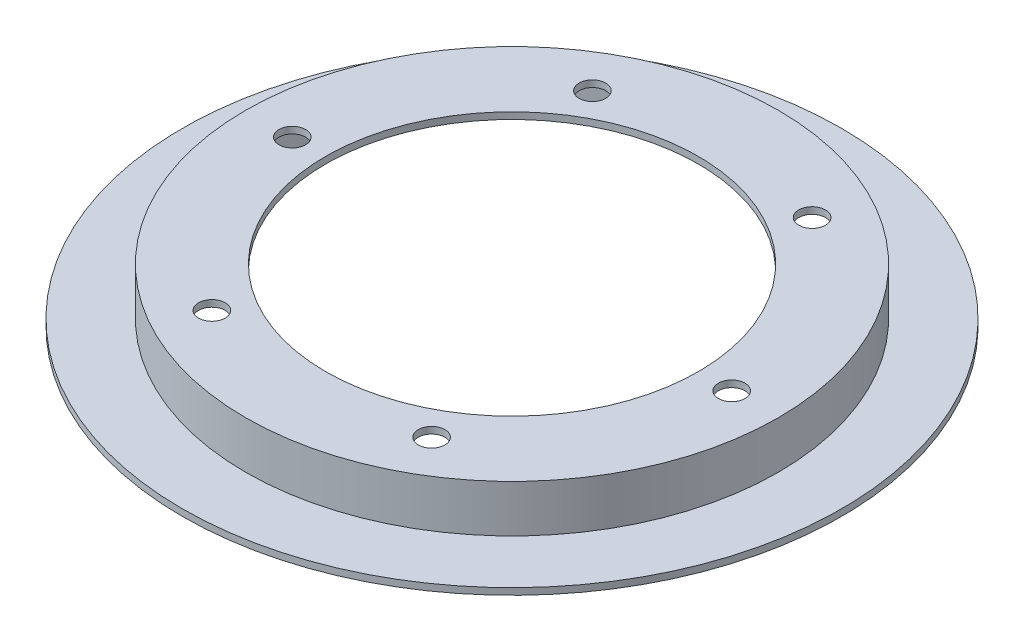
ISO-10303-21;
HEADER;
FILE_DESCRIPTION(('STEP AP214'),'2;1');
FILE_NAME('part.step','',(''),(''),'','','');
FILE_SCHEMA(('AUTOMOTIVE_DESIGN { 1 0 10303 214 1 1 1 1 }'));
ENDSEC;
DATA;
#1=APPLICATION_CONTEXT('core data for automotive mechanical design processes');
#2=APPLICATION_PROTOCOL_DEFINITION('international standard','automotive_design',2000,#1);
#3=PRODUCT_CONTEXT('',#1,'mechanical');
#4=PRODUCT('Part','Part','',(#3));
#5=PRODUCT_RELATED_PRODUCT_CATEGORY('part','',(#4));
#6=PRODUCT_DEFINITION_FORMATION('','',#4);
#7=PRODUCT_DEFINITION_CONTEXT('part definition',#1,'design');
#8=PRODUCT_DEFINITION('design','',#6,#7);
#9=PRODUCT_DEFINITION_SHAPE('','',#8);
#10=(LENGTH_UNIT() NAMED_UNIT(*) SI_UNIT(.MILLI.,.METRE.));
#11=(NAMED_UNIT(*) PLANE_ANGLE_UNIT() SI_UNIT($,.RADIAN.));
#12=(NAMED_UNIT(*) SI_UNIT($,.STERADIAN.) SOLID_ANGLE_UNIT());
#13=UNCERTAINTY_MEASURE_WITH_UNIT(LENGTH_MEASURE(1.E-05),#10,'distance_accuracy_value','');
#14=(GEOMETRIC_REPRESENTATION_CONTEXT(3) GLOBAL_UNCERTAINTY_ASSIGNED_CONTEXT((#13)) GLOBAL_UNIT_ASSIGNED_CONTEXT((#10,
#11,#12)) REPRESENTATION_CONTEXT('',''));
#15=CARTESIAN_POINT('',(0.,0.,0.));
#16=DIRECTION('',(0.,0.,1.));
#17=DIRECTION('',(1.,0.,0.));
#18=AXIS2_PLACEMENT_3D('',#15,#16,#17);
#19=CARTESIAN_POINT('',(0.,-7.1,0.));
#20=DIRECTION('',(0.,1.,0.));
#21=DIRECTION('',(0.,0.,1.));
#22=AXIS2_PLACEMENT_3D('',#19,#20,#21);
#23=CYLINDRICAL_SURFACE('',#22,39.);
#24=CARTESIAN_POINT('',(0.,-1.,0.));
#25=DIRECTION('',(0.,1.,0.));
#26=DIRECTION('',(0.,0.,1.));
#27=AXIS2_PLACEMENT_3D('',#24,#25,#26);
#28=CIRCLE('',#27,39.);
#29=CARTESIAN_POINT('',(34.5000000000002,-1.,18.1865334794729));
#30=VERTEX_POINT('',#29);
#31=CARTESIAN_POINT('',(34.4999999999998,-1.,-18.1865334794736));
#32=VERTEX_POINT('',#31);
#33=EDGE_CURVE('E470',#30,#32,#28,.T.);
#34=ORIENTED_EDGE('',*,*,#33,.T.);
#35=DIRECTION('',(0.,1.,0.));
#36=VECTOR('',#35,1.);
#37=CARTESIAN_POINT('',(34.4999999999998,-7.1,-18.1865334794736));
#38=LINE('',#37,#36);
#39=CARTESIAN_POINT('',(34.4999999999998,-8.07723516768089,-18.1865334794736));
#40=VERTEX_POINT('',#39);
#41=EDGE_CURVE('E215',#32,#40,#38,.F.);
#42=ORIENTED_EDGE('',*,*,#41,.T.);
#43=CARTESIAN_POINT('',(0.,22.6666666666667,0.));
#44=DIRECTION('',(0.536382713215949,0.785106009795784,-0.309680703863899));
#45=DIRECTION('',(-0.679921749146978,0.619361407727785,0.3925530048979));
#46=AXIS2_PLACEMENT_3D('',#43,#44,#45);
#47=ELLIPSE('',#46,49.6748203597937,39.);
#48=CARTESIAN_POINT('',(33.7749907475929,-8.1,-19.5000000000004));
#49=VERTEX_POINT('',#48);
#50=EDGE_CURVE('E200',#40,#49,#47,.T.);
#51=ORIENTED_EDGE('',*,*,#50,.T.);
#52=CARTESIAN_POINT('',(0.,-8.1,0.));
#53=DIRECTION('',(0.,-1.,0.));
#54=DIRECTION('',(0.,0.,-1.));
#55=AXIS2_PLACEMENT_3D('',#52,#53,#54);
#56=CIRCLE('',#55,39.);
#57=CARTESIAN_POINT('',(33.7749907475933,-8.1,19.4999999999997));
#58=VERTEX_POINT('',#57);
#59=EDGE_CURVE('E328',#49,#58,#56,.T.);
#60=ORIENTED_EDGE('',*,*,#59,.T.);
#61=CARTESIAN_POINT('',(0.,22.6666666666667,0.));
#62=DIRECTION('',(0.536382713215956,0.785106009795783,0.309680703863887));
#63=DIRECTION('',(-0.679921749146986,0.619361407727785,-0.392553004897885));
#64=AXIS2_PLACEMENT_3D('',#61,#62,#63);
#65=ELLIPSE('',#64,49.6748203597937,39.);
#66=CARTESIAN_POINT('',(34.5000000000002,-8.07723516768091,18.1865334794729));
#67=VERTEX_POINT('',#66);
#68=EDGE_CURVE('E235',#58,#67,#65,.T.);
#69=ORIENTED_EDGE('',*,*,#68,.T.);
#70=DIRECTION('',(0.,1.,0.));
#71=VECTOR('',#70,1.);
#72=CARTESIAN_POINT('',(34.5000000000002,-7.1,18.1865334794729));
#73=LINE('',#72,#71);
#74=EDGE_CURVE('E223',#30,#67,#73,.F.);
#75=ORIENTED_EDGE('',*,*,#74,.F.);
#76=EDGE_LOOP('',(#34,#42,#51,#60,#69,#75));
#77=FACE_BOUND('',#76,.T.);
#78=ADVANCED_FACE('F45',(#77),#23,.F.);
#79=CARTESIAN_POINT('',(1.5,-1.,38.9711431702997));
#80=VERTEX_POINT('',#79);
#81=CARTESIAN_POINT('',(33.0000000000002,-1.,20.7846096908262));
#82=VERTEX_POINT('',#81);
#83=EDGE_CURVE('E472',#80,#82,#28,.T.);
#84=ORIENTED_EDGE('',*,*,#83,.T.);
#85=DIRECTION('',(0.,1.,0.));
#86=VECTOR('',#85,1.);
#87=CARTESIAN_POINT('',(33.0000000000002,-7.1,20.7846096908262));
#88=LINE('',#87,#86);
#89=CARTESIAN_POINT('',(33.0000000000002,-8.07723516768089,20.7846096908262));
#90=VERTEX_POINT('',#89);
#91=EDGE_CURVE('E231',#82,#90,#88,.F.);
#92=ORIENTED_EDGE('',*,*,#91,.T.);
#93=EDGE_CURVE('E237',#90,#58,#65,.T.);
#94=ORIENTED_EDGE('',*,*,#93,.T.);
#95=CARTESIAN_POINT('',(0.,-8.1,39.));
#96=VERTEX_POINT('',#95);
#97=EDGE_CURVE('E452',#58,#96,#56,.T.);
#98=ORIENTED_EDGE('',*,*,#97,.T.);
#99=CARTESIAN_POINT('',(0.,22.6666666666667,0.));
#100=DIRECTION('',(0.,0.785106009795784,0.619361407727785));
#101=DIRECTION('',(0.,0.619361407727785,-0.785106009795784));
#102=AXIS2_PLACEMENT_3D('',#99,#100,#101);
#103=ELLIPSE('',#102,49.6748203597937,39.);
#104=CARTESIAN_POINT('',(1.5,-8.07723516768091,38.9711431702997));
#105=VERTEX_POINT('',#104);
#106=EDGE_CURVE('E256',#96,#105,#103,.T.);
#107=ORIENTED_EDGE('',*,*,#106,.T.);
#108=DIRECTION('',(0.,1.,0.));
#109=VECTOR('',#108,1.);
#110=CARTESIAN_POINT('',(1.5,-7.1,38.9711431702997));
#111=LINE('',#110,#109);
#112=EDGE_CURVE('E244',#80,#105,#111,.F.);
#113=ORIENTED_EDGE('',*,*,#112,.F.);
#114=EDGE_LOOP('',(#84,#92,#94,#98,#107,#113));
#115=FACE_BOUND('',#114,.T.);
#116=ADVANCED_FACE('F398',(#115),#23,.F.);
#117=CARTESIAN_POINT('',(-32.9999999999999,-1.,20.7846096908267));
#118=VERTEX_POINT('',#117);
#119=CARTESIAN_POINT('',(-1.5,-1.,38.9711431702997));
#120=VERTEX_POINT('',#119);
#121=EDGE_CURVE('E473',#118,#120,#28,.T.);
#122=ORIENTED_EDGE('',*,*,#121,.T.);
#123=DIRECTION('',(0.,1.,0.));
#124=VECTOR('',#123,1.);
#125=CARTESIAN_POINT('',(-1.5,-7.1,38.9711431702997));
#126=LINE('',#125,#124);
#127=CARTESIAN_POINT('',(-1.5,-8.07723516768091,38.9711431702997));
#128=VERTEX_POINT('',#127);
#129=EDGE_CURVE('E252',#120,#128,#126,.F.);
#130=ORIENTED_EDGE('',*,*,#129,.T.);
#131=EDGE_CURVE('E258',#128,#96,#103,.T.);
#132=ORIENTED_EDGE('',*,*,#131,.T.);
#133=CARTESIAN_POINT('',(-33.774990747593,-8.1,19.5000000000002));
#134=VERTEX_POINT('',#133);
#135=EDGE_CURVE('E450',#96,#134,#56,.T.);
#136=ORIENTED_EDGE('',*,*,#135,.T.);
#137=CARTESIAN_POINT('',(0.,22.6666666666667,0.));
#138=DIRECTION('',(-0.536382713215952,0.785106009795783,0.309680703863895));
#139=DIRECTION('',(0.679921749146981,0.619361407727785,-0.392553004897895));
#140=AXIS2_PLACEMENT_3D('',#137,#138,#139);
#141=ELLIPSE('',#140,49.6748203597937,39.);
#142=CARTESIAN_POINT('',(-32.9999999999999,-8.0772351676809,20.7846096908267));
#143=VERTEX_POINT('',#142);
#144=EDGE_CURVE('E277',#134,#143,#141,.T.);
#145=ORIENTED_EDGE('',*,*,#144,.T.);
#146=DIRECTION('',(0.,1.,0.));
#147=VECTOR('',#146,1.);
#148=CARTESIAN_POINT('',(-32.9999999999999,-7.1,20.7846096908267));
#149=LINE('',#148,#147);
#150=EDGE_CURVE('E265',#118,#143,#149,.F.);
#151=ORIENTED_EDGE('',*,*,#150,.F.);
#152=EDGE_LOOP('',(#122,#130,#132,#136,#145,#151));
#153=FACE_BOUND('',#152,.T.);
#154=ADVANCED_FACE('F404',(#153),#23,.F.);
#155=CARTESIAN_POINT('',(-34.5,-1.,-18.1865334794731));
#156=VERTEX_POINT('',#155);
#157=CARTESIAN_POINT('',(-34.4999999999999,-1.,18.1865334794734));
#158=VERTEX_POINT('',#157);
#159=EDGE_CURVE('E54',#156,#158,#28,.T.);
#160=ORIENTED_EDGE('',*,*,#159,.T.);
#161=DIRECTION('',(0.,1.,0.));
#162=VECTOR('',#161,1.);
#163=CARTESIAN_POINT('',(-34.4999999999999,-7.1,18.1865334794734));
#164=LINE('',#163,#162);
#165=CARTESIAN_POINT('',(-34.4999999999999,-8.07723516768089,18.1865334794734));
#166=VERTEX_POINT('',#165);
#167=EDGE_CURVE('E273',#158,#166,#164,.F.);
#168=ORIENTED_EDGE('',*,*,#167,.T.);
#169=EDGE_CURVE('E279',#166,#134,#141,.T.);
#170=ORIENTED_EDGE('',*,*,#169,.T.);
#171=CARTESIAN_POINT('',(-33.7749907475931,-8.1,-19.4999999999999));
#172=VERTEX_POINT('',#171);
#173=EDGE_CURVE('E447',#134,#172,#56,.T.);
#174=ORIENTED_EDGE('',*,*,#173,.T.);
#175=CARTESIAN_POINT('',(0.,22.6666666666667,0.));
#176=DIRECTION('',(-0.536382713215954,0.785106009795783,-0.309680703863891));
#177=DIRECTION('',(0.679921749146984,0.619361407727785,0.39255300489789));
#178=AXIS2_PLACEMENT_3D('',#175,#176,#177);
#179=ELLIPSE('',#178,49.6748203597937,39.);
#180=CARTESIAN_POINT('',(-34.5,-8.0772351676809,-18.1865334794731));
#181=VERTEX_POINT('',#180);
#182=EDGE_CURVE('E298',#172,#181,#179,.T.);
#183=ORIENTED_EDGE('',*,*,#182,.T.);
#184=DIRECTION('',(0.,1.,0.));
#185=VECTOR('',#184,1.);
#186=CARTESIAN_POINT('',(-34.5,-7.1,-18.1865334794731));
#187=LINE('',#186,#185);
#188=EDGE_CURVE('E286',#156,#181,#187,.F.);
#189=ORIENTED_EDGE('',*,*,#188,.F.);
#190=EDGE_LOOP('',(#160,#168,#170,#174,#183,#189));
#191=FACE_BOUND('',#190,.T.);
#192=ADVANCED_FACE('F420',(#191),#23,.F.);
#193=CARTESIAN_POINT('',(-1.5,-1.,-38.9711431702997));
#194=VERTEX_POINT('',#193);
#195=CARTESIAN_POINT('',(-33.,-1.,-20.7846096908265));
#196=VERTEX_POINT('',#195);
#197=EDGE_CURVE('E11',#194,#196,#28,.T.);
#198=ORIENTED_EDGE('',*,*,#197,.T.);
#199=DIRECTION('',(0.,1.,0.));
#200=VECTOR('',#199,1.);
#201=CARTESIAN_POINT('',(-33.,-7.1,-20.7846096908265));
#202=LINE('',#201,#200);
#203=CARTESIAN_POINT('',(-33.,-8.07723516768089,-20.7846096908264));
#204=VERTEX_POINT('',#203);
#205=EDGE_CURVE('E294',#196,#204,#202,.F.);
#206=ORIENTED_EDGE('',*,*,#205,.T.);
#207=EDGE_CURVE('E300',#204,#172,#179,.T.);
#208=ORIENTED_EDGE('',*,*,#207,.T.);
#209=CARTESIAN_POINT('',(0.,-8.1,-39.));
#210=VERTEX_POINT('',#209);
#211=EDGE_CURVE('E325',#172,#210,#56,.T.);
#212=ORIENTED_EDGE('',*,*,#211,.T.);
#213=CARTESIAN_POINT('',(0.,22.6666666666667,0.));
#214=DIRECTION('',(0.,0.785106009795784,-0.619361407727785));
#215=DIRECTION('',(0.,0.619361407727785,0.785106009795784));
#216=AXIS2_PLACEMENT_3D('',#213,#214,#215);
#217=ELLIPSE('',#216,49.6748203597937,39.);
#218=CARTESIAN_POINT('',(-1.5,-8.07723516768091,-38.9711431702997));
#219=VERTEX_POINT('',#218);
#220=EDGE_CURVE('E320',#210,#219,#217,.T.);
#221=ORIENTED_EDGE('',*,*,#220,.T.);
#222=DIRECTION('',(0.,1.,0.));
#223=VECTOR('',#222,1.);
#224=CARTESIAN_POINT('',(-1.5,-7.1,-38.9711431702997));
#225=LINE('',#224,#223);
#226=EDGE_CURVE('E307',#194,#219,#225,.F.);
#227=ORIENTED_EDGE('',*,*,#226,.F.);
#228=EDGE_LOOP('',(#198,#206,#208,#212,#221,#227));
#229=FACE_BOUND('',#228,.T.);
#230=ADVANCED_FACE('F411',(#229),#23,.F.);
#231=CARTESIAN_POINT('',(0.,-1.,0.));
#232=DIRECTION('',(0.,1.,0.));
#233=DIRECTION('',(0.,0.,1.));
#234=AXIS2_PLACEMENT_3D('',#231,#232,#233);
#235=PLANE('',#234);
#236=CARTESIAN_POINT('',(0.,-1.,0.));
#237=DIRECTION('',(0.,1.,0.));
#238=DIRECTION('',(0.,0.,1.));
#239=AXIS2_PLACEMENT_3D('',#236,#237,#238);
#240=CIRCLE('',#239,28.);
#241=CARTESIAN_POINT('',(0.,-1.,28.));
#242=VERTEX_POINT('',#241);
#243=EDGE_CURVE('E356',#242,#242,#240,.T.);
#244=ORIENTED_EDGE('',*,*,#243,.T.);
#245=EDGE_LOOP('',(#244));
#246=FACE_BOUND('',#245,.T.);
#247=CARTESIAN_POINT('',(16.5,-1.,28.5788383248865));
#248=DIRECTION('',(0.,1.,0.));
#249=DIRECTION('',(0.,0.,1.));
#250=AXIS2_PLACEMENT_3D('',#247,#248,#249);
#251=CIRCLE('',#250,2.00000000000001);
#252=CARTESIAN_POINT('',(16.5,-1.,30.5788383248865));
#253=VERTEX_POINT('',#252);
#254=EDGE_CURVE('E353',#253,#253,#251,.T.);
#255=ORIENTED_EDGE('',*,*,#254,.T.);
#256=EDGE_LOOP('',(#255));
#257=FACE_BOUND('',#256,.T.);
#258=CARTESIAN_POINT('',(-16.5,-1.,28.5788383248865));
#259=DIRECTION('',(0.,1.,0.));
#260=DIRECTION('',(0.,0.,1.));
#261=AXIS2_PLACEMENT_3D('',#258,#259,#260);
#262=CIRCLE('',#261,2.00000000000001);
#263=CARTESIAN_POINT('',(-16.5,-1.,30.5788383248865));
#264=VERTEX_POINT('',#263);
#265=EDGE_CURVE('E350',#264,#264,#262,.T.);
#266=ORIENTED_EDGE('',*,*,#265,.T.);
#267=EDGE_LOOP('',(#266));
#268=FACE_BOUND('',#267,.T.);
#269=CARTESIAN_POINT('',(-33.,-1.,0.));
#270=DIRECTION('',(0.,1.,0.));
#271=DIRECTION('',(0.,0.,1.));
#272=AXIS2_PLACEMENT_3D('',#269,#270,#271);
#273=CIRCLE('',#272,2.);
#274=CARTESIAN_POINT('',(-33.,-1.,2.00000000000001));
#275=VERTEX_POINT('',#274);
#276=EDGE_CURVE('E347',#275,#275,#273,.T.);
#277=ORIENTED_EDGE('',*,*,#276,.T.);
#278=EDGE_LOOP('',(#277));
#279=FACE_BOUND('',#278,.T.);
#280=CARTESIAN_POINT('',(-16.5,-1.,-28.5788383248865));
#281=DIRECTION('',(0.,1.,0.));
#282=DIRECTION('',(0.,0.,1.));
#283=AXIS2_PLACEMENT_3D('',#280,#281,#282);
#284=CIRCLE('',#283,2.00000000000001);
#285=CARTESIAN_POINT('',(-16.5,-1.,-26.5788383248865));
#286=VERTEX_POINT('',#285);
#287=EDGE_CURVE('E344',#286,#286,#284,.T.);
#288=ORIENTED_EDGE('',*,*,#287,.T.);
#289=EDGE_LOOP('',(#288));
#290=FACE_BOUND('',#289,.T.);
#291=CARTESIAN_POINT('',(16.5,-1.,-28.5788383248865));
#292=DIRECTION('',(0.,1.,0.));
#293=DIRECTION('',(0.,0.,1.));
#294=AXIS2_PLACEMENT_3D('',#291,#292,#293);
#295=CIRCLE('',#294,2.00000000000001);
#296=CARTESIAN_POINT('',(16.5,-1.,-26.5788383248865));
#297=VERTEX_POINT('',#296);
#298=EDGE_CURVE('E341',#297,#297,#295,.T.);
#299=ORIENTED_EDGE('',*,*,#298,.T.);
#300=EDGE_LOOP('',(#299));
#301=FACE_BOUND('',#300,.T.);
#302=CARTESIAN_POINT('',(33.,-1.,0.));
#303=DIRECTION('',(0.,1.,0.));
#304=DIRECTION('',(0.,0.,1.));
#305=AXIS2_PLACEMENT_3D('',#302,#303,#304);
#306=CIRCLE('',#305,2.);
#307=CARTESIAN_POINT('',(33.,-1.,2.));
#308=VERTEX_POINT('',#307);
#309=EDGE_CURVE('E338',#308,#308,#306,.T.);
#310=ORIENTED_EDGE('',*,*,#309,.T.);
#311=EDGE_LOOP('',(#310));
#312=FACE_BOUND('',#311,.T.);
#313=DIRECTION('',(0.866025403784433,0.,-0.50000000000001));
#314=VECTOR('',#313,1.);
#315=CARTESIAN_POINT('',(0.750000000000016,-1.,1.29903810567665));
#316=LINE('',#315,#314);
#317=CARTESIAN_POINT('',(26.730762113533,-0.999999999999997,-13.7009618943237));
#318=VERTEX_POINT('',#317);
#319=EDGE_CURVE('E201',#318,#32,#316,.T.);
#320=ORIENTED_EDGE('',*,*,#319,.T.);
#321=ORIENTED_EDGE('',*,*,#33,.F.);
#322=DIRECTION('',(0.866025403784443,0.,0.499999999999992));
#323=VECTOR('',#322,1.);
#324=CARTESIAN_POINT('',(0.749999999999987,-1.,-1.29903810567666));
#325=LINE('',#324,#323);
#326=CARTESIAN_POINT('',(26.7307621135333,-1.,13.7009618943231));
#327=VERTEX_POINT('',#326);
#328=EDGE_CURVE('E228',#327,#30,#325,.T.);
#329=ORIENTED_EDGE('',*,*,#328,.F.);
#330=DIRECTION('',(0.499999999999992,0.,-0.866025403784443));
#331=VECTOR('',#330,1.);
#332=CARTESIAN_POINT('',(25.9807621135333,-1.,14.9999999999998));
#333=LINE('',#332,#331);
#334=CARTESIAN_POINT('',(25.2307621135333,-0.999999999999999,16.2990381056764));
#335=VERTEX_POINT('',#334);
#336=EDGE_CURVE('E238',#327,#335,#333,.F.);
#337=ORIENTED_EDGE('',*,*,#336,.T.);
#338=DIRECTION('',(0.866025403784443,0.,0.499999999999992));
#339=VECTOR('',#338,1.);
#340=CARTESIAN_POINT('',(-0.749999999999989,-1.,1.29903810567667));
#341=LINE('',#340,#339);
#342=EDGE_CURVE('E233',#335,#82,#341,.T.);
#343=ORIENTED_EDGE('',*,*,#342,.T.);
#344=ORIENTED_EDGE('',*,*,#83,.F.);
#345=DIRECTION('',(0.,0.,1.));
#346=VECTOR('',#345,1.);
#347=CARTESIAN_POINT('',(1.5,-1.,0.));
#348=LINE('',#347,#346);
#349=CARTESIAN_POINT('',(1.5,-1.,30.));
#350=VERTEX_POINT('',#349);
#351=EDGE_CURVE('E249',#350,#80,#348,.T.);
#352=ORIENTED_EDGE('',*,*,#351,.F.);
#353=DIRECTION('',(1.,0.,0.));
#354=VECTOR('',#353,1.);
#355=CARTESIAN_POINT('',(0.,-1.,30.));
#356=LINE('',#355,#354);
#357=CARTESIAN_POINT('',(-1.5,-1.,30.));
#358=VERTEX_POINT('',#357);
#359=EDGE_CURVE('E259',#350,#358,#356,.F.);
#360=ORIENTED_EDGE('',*,*,#359,.T.);
#361=DIRECTION('',(0.,0.,1.));
#362=VECTOR('',#361,1.);
#363=CARTESIAN_POINT('',(-1.5,-1.,0.));
#364=LINE('',#363,#362);
#365=EDGE_CURVE('E254',#358,#120,#364,.T.);
#366=ORIENTED_EDGE('',*,*,#365,.T.);
#367=ORIENTED_EDGE('',*,*,#121,.F.);
#368=DIRECTION('',(-0.866025403784436,0.,0.500000000000004));
#369=VECTOR('',#368,1.);
#370=CARTESIAN_POINT('',(0.750000000000006,-1.,1.29903810567665));
#371=LINE('',#370,#369);
#372=CARTESIAN_POINT('',(-25.2307621135331,-1.00000000000001,16.2990381056768));
#373=VERTEX_POINT('',#372);
#374=EDGE_CURVE('E270',#373,#118,#371,.T.);
#375=ORIENTED_EDGE('',*,*,#374,.F.);
#376=DIRECTION('',(0.500000000000004,0.,0.866025403784436));
#377=VECTOR('',#376,1.);
#378=CARTESIAN_POINT('',(-25.9807621135331,-1.,15.0000000000001));
#379=LINE('',#378,#377);
#380=CARTESIAN_POINT('',(-26.7307621135331,-0.999999999999999,13.7009618943235));
#381=VERTEX_POINT('',#380);
#382=EDGE_CURVE('E280',#373,#381,#379,.F.);
#383=ORIENTED_EDGE('',*,*,#382,.T.);
#384=DIRECTION('',(-0.866025403784436,0.,0.500000000000004));
#385=VECTOR('',#384,1.);
#386=CARTESIAN_POINT('',(-0.750000000000006,-1.,-1.29903810567665));
#387=LINE('',#386,#385);
#388=EDGE_CURVE('E275',#381,#158,#387,.T.);
#389=ORIENTED_EDGE('',*,*,#388,.T.);
#390=ORIENTED_EDGE('',*,*,#159,.F.);
#391=DIRECTION('',(-0.86602540378444,0.,-0.499999999999998));
#392=VECTOR('',#391,1.);
#393=CARTESIAN_POINT('',(-0.749999999999997,-1.,1.29903810567666));
#394=LINE('',#393,#392);
#395=CARTESIAN_POINT('',(-26.7307621135332,-0.999999999999999,-13.7009618943233));
#396=VERTEX_POINT('',#395);
#397=EDGE_CURVE('E291',#396,#156,#394,.T.);
#398=ORIENTED_EDGE('',*,*,#397,.F.);
#399=DIRECTION('',(-0.499999999999998,0.,0.86602540378444));
#400=VECTOR('',#399,1.);
#401=CARTESIAN_POINT('',(-25.9807621135332,-1.,-14.9999999999999));
#402=LINE('',#401,#400);
#403=CARTESIAN_POINT('',(-25.2307621135332,-0.999999999999999,-16.2990381056766));
#404=VERTEX_POINT('',#403);
#405=EDGE_CURVE('E301',#396,#404,#402,.F.);
#406=ORIENTED_EDGE('',*,*,#405,.T.);
#407=DIRECTION('',(-0.86602540378444,0.,-0.499999999999998));
#408=VECTOR('',#407,1.);
#409=CARTESIAN_POINT('',(0.749999999999997,-1.,-1.29903810567666));
#410=LINE('',#409,#408);
#411=EDGE_CURVE('E296',#404,#196,#410,.T.);
#412=ORIENTED_EDGE('',*,*,#411,.T.);
#413=ORIENTED_EDGE('',*,*,#197,.F.);
#414=DIRECTION('',(0.,0.,-1.));
#415=VECTOR('',#414,1.);
#416=CARTESIAN_POINT('',(-1.5,-1.,0.));
#417=LINE('',#416,#415);
#418=CARTESIAN_POINT('',(-1.5,-1.,-30.));
#419=VERTEX_POINT('',#418);
#420=EDGE_CURVE('E312',#419,#194,#417,.T.);
#421=ORIENTED_EDGE('',*,*,#420,.F.);
#422=DIRECTION('',(-1.,0.,0.));
#423=VECTOR('',#422,1.);
#424=CARTESIAN_POINT('',(0.,-1.,-30.));
#425=LINE('',#424,#423);
#426=CARTESIAN_POINT('',(1.5,-1.,-30.));
#427=VERTEX_POINT('',#426);
#428=EDGE_CURVE('E323',#419,#427,#425,.F.);
#429=ORIENTED_EDGE('',*,*,#428,.T.);
#430=DIRECTION('',(0.,0.,-1.));
#431=VECTOR('',#430,1.);
#432=CARTESIAN_POINT('',(1.5,-1.,0.));
#433=LINE('',#432,#431);
#434=CARTESIAN_POINT('',(1.5,-1.,-38.9711431702997));
#435=VERTEX_POINT('',#434);
#436=EDGE_CURVE('E317',#427,#435,#433,.T.);
#437=ORIENTED_EDGE('',*,*,#436,.T.);
#438=CARTESIAN_POINT('',(32.9999999999998,-1.,-20.7846096908269));
#439=VERTEX_POINT('',#438);
#440=EDGE_CURVE('E56',#439,#435,#28,.T.);
#441=ORIENTED_EDGE('',*,*,#440,.F.);
#442=DIRECTION('',(0.866025403784433,0.,-0.50000000000001));
#443=VECTOR('',#442,1.);
#444=CARTESIAN_POINT('',(-0.750000000000014,-1.,-1.29903810567665));
#445=LINE('',#444,#443);
#446=CARTESIAN_POINT('',(25.230762113533,-0.999999999999999,-16.299038105677));
#447=VERTEX_POINT('',#446);
#448=EDGE_CURVE('E68',#447,#439,#445,.T.);
#449=ORIENTED_EDGE('',*,*,#448,.F.);
#450=DIRECTION('',(-0.50000000000001,0.,-0.866025403784433));
#451=VECTOR('',#450,1.);
#452=CARTESIAN_POINT('',(25.980762113533,-1.,-15.0000000000003));
#453=LINE('',#452,#451);
#454=EDGE_CURVE('E63',#447,#318,#453,.F.);
#455=ORIENTED_EDGE('',*,*,#454,.T.);
#456=EDGE_LOOP('',(#320,#321,#329,#337,#343,#344,#352,#360,#366,#367,#375,#383,#389,#390,#398,
#406,#412,#413,#421,#429,#437,#441,#449,#455));
#457=FACE_BOUND('',#456,.T.);
#458=ADVANCED_FACE('F419',(#246,#257,#268,#279,#290,#301,#312,#457),#235,.F.);
#459=CARTESIAN_POINT('',(0.,-1.,0.));
#460=DIRECTION('',(0.,1.,0.));
#461=DIRECTION('',(0.,0.,1.));
#462=AXIS2_PLACEMENT_3D('',#459,#460,#461);
#463=CYLINDRICAL_SURFACE('',#462,28.);
#464=ORIENTED_EDGE('',*,*,#243,.F.);
#465=EDGE_LOOP('',(#464));
#466=FACE_BOUND('',#465,.T.);
#467=CARTESIAN_POINT('',(0.,0.,0.));
#468=DIRECTION('',(0.,1.,0.));
#469=DIRECTION('',(0.,0.,1.));
#470=AXIS2_PLACEMENT_3D('',#467,#468,#469);
#471=CIRCLE('',#470,28.);
#472=CARTESIAN_POINT('',(0.,0.,28.));
#473=VERTEX_POINT('',#472);
#474=EDGE_CURVE('E375',#473,#473,#471,.T.);
#475=ORIENTED_EDGE('',*,*,#474,.T.);
#476=EDGE_LOOP('',(#475));
#477=FACE_BOUND('',#476,.T.);
#478=ADVANCED_FACE('F426',(#466,#477),#463,.F.);
#479=CARTESIAN_POINT('',(16.5,-1.,28.5788383248865));
#480=DIRECTION('',(0.,1.,0.));
#481=DIRECTION('',(0.,0.,1.));
#482=AXIS2_PLACEMENT_3D('',#479,#480,#481);
#483=CYLINDRICAL_SURFACE('',#482,2.00000000000001);
#484=ORIENTED_EDGE('',*,*,#254,.F.);
#485=EDGE_LOOP('',(#484));
#486=FACE_BOUND('',#485,.T.);
#487=CARTESIAN_POINT('',(16.5,0.,28.5788383248865));
#488=DIRECTION('',(0.,1.,0.));
#489=DIRECTION('',(0.,0.,1.));
#490=AXIS2_PLACEMENT_3D('',#487,#488,#489);
#491=CIRCLE('',#490,2.00000000000001);
#492=CARTESIAN_POINT('',(16.5,0.,30.5788383248865));
#493=VERTEX_POINT('',#492);
#494=EDGE_CURVE('E373',#493,#493,#491,.T.);
#495=ORIENTED_EDGE('',*,*,#494,.T.);
#496=EDGE_LOOP('',(#495));
#497=FACE_BOUND('',#496,.T.);
#498=ADVANCED_FACE('F675',(#486,#497),#483,.F.);
#499=CARTESIAN_POINT('',(-16.5,-1.,28.5788383248865));
#500=DIRECTION('',(0.,1.,0.));
#501=DIRECTION('',(0.,0.,1.));
#502=AXIS2_PLACEMENT_3D('',#499,#500,#501);
#503=CYLINDRICAL_SURFACE('',#502,2.00000000000001);
#504=ORIENTED_EDGE('',*,*,#265,.F.);
#505=EDGE_LOOP('',(#504));
#506=FACE_BOUND('',#505,.T.);
#507=CARTESIAN_POINT('',(-16.5,0.,28.5788383248865));
#508=DIRECTION('',(0.,1.,0.));
#509=DIRECTION('',(0.,0.,1.));
#510=AXIS2_PLACEMENT_3D('',#507,#508,#509);
#511=CIRCLE('',#510,2.00000000000001);
#512=CARTESIAN_POINT('',(-16.5,0.,30.5788383248865));
#513=VERTEX_POINT('',#512);
#514=EDGE_CURVE('E370',#513,#513,#511,.T.);
#515=ORIENTED_EDGE('',*,*,#514,.T.);
#516=EDGE_LOOP('',(#515));
#517=FACE_BOUND('',#516,.T.);
#518=ADVANCED_FACE('F664',(#506,#517),#503,.F.);
#519=CARTESIAN_POINT('',(-33.,-1.,0.));
#520=DIRECTION('',(0.,1.,0.));
#521=DIRECTION('',(0.,0.,1.));
#522=AXIS2_PLACEMENT_3D('',#519,#520,#521);
#523=CYLINDRICAL_SURFACE('',#522,2.);
#524=ORIENTED_EDGE('',*,*,#276,.F.);
#525=EDGE_LOOP('',(#524));
#526=FACE_BOUND('',#525,.T.);
#527=CARTESIAN_POINT('',(-33.,0.,0.));
#528=DIRECTION('',(0.,1.,0.));
#529=DIRECTION('',(0.,0.,1.));
#530=AXIS2_PLACEMENT_3D('',#527,#528,#529);
#531=CIRCLE('',#530,2.);
#532=CARTESIAN_POINT('',(-33.,0.,2.00000000000001));
#533=VERTEX_POINT('',#532);
#534=EDGE_CURVE('E367',#533,#533,#531,.T.);
#535=ORIENTED_EDGE('',*,*,#534,.T.);
#536=EDGE_LOOP('',(#535));
#537=FACE_BOUND('',#536,.T.);
#538=ADVANCED_FACE('F653',(#526,#537),#523,.F.);
#539=CARTESIAN_POINT('',(-16.5,-1.,-28.5788383248865));
#540=DIRECTION('',(0.,1.,0.));
#541=DIRECTION('',(0.,0.,1.));
#542=AXIS2_PLACEMENT_3D('',#539,#540,#541);
#543=CYLINDRICAL_SURFACE('',#542,2.00000000000001);
#544=ORIENTED_EDGE('',*,*,#287,.F.);
#545=EDGE_LOOP('',(#544));
#546=FACE_BOUND('',#545,.T.);
#547=CARTESIAN_POINT('',(-16.5,0.,-28.5788383248865));
#548=DIRECTION('',(0.,1.,0.));
#549=DIRECTION('',(0.,0.,1.));
#550=AXIS2_PLACEMENT_3D('',#547,#548,#549);
#551=CIRCLE('',#550,2.00000000000001);
#552=CARTESIAN_POINT('',(-16.5,0.,-26.5788383248865));
#553=VERTEX_POINT('',#552);
#554=EDGE_CURVE('E364',#553,#553,#551,.T.);
#555=ORIENTED_EDGE('',*,*,#554,.T.);
#556=EDGE_LOOP('',(#555));
#557=FACE_BOUND('',#556,.T.);
#558=ADVANCED_FACE('F643',(#546,#557),#543,.F.);
#559=CARTESIAN_POINT('',(16.5,-1.,-28.5788383248865));
#560=DIRECTION('',(0.,1.,0.));
#561=DIRECTION('',(0.,0.,1.));
#562=AXIS2_PLACEMENT_3D('',#559,#560,#561);
#563=CYLINDRICAL_SURFACE('',#562,2.00000000000001);
#564=ORIENTED_EDGE('',*,*,#298,.F.);
#565=EDGE_LOOP('',(#564));
#566=FACE_BOUND('',#565,.T.);
#567=CARTESIAN_POINT('',(16.5,0.,-28.5788383248865));
#568=DIRECTION('',(0.,1.,0.));
#569=DIRECTION('',(0.,0.,1.));
#570=AXIS2_PLACEMENT_3D('',#567,#568,#569);
#571=CIRCLE('',#570,2.00000000000001);
#572=CARTESIAN_POINT('',(16.5,0.,-26.5788383248865));
#573=VERTEX_POINT('',#572);
#574=EDGE_CURVE('E361',#573,#573,#571,.T.);
#575=ORIENTED_EDGE('',*,*,#574,.T.);
#576=EDGE_LOOP('',(#575));
#577=FACE_BOUND('',#576,.T.);
#578=ADVANCED_FACE('F394',(#566,#577),#563,.F.);
#579=CARTESIAN_POINT('',(33.,-1.,0.));
#580=DIRECTION('',(0.,1.,0.));
#581=DIRECTION('',(0.,0.,1.));
#582=AXIS2_PLACEMENT_3D('',#579,#580,#581);
#583=CYLINDRICAL_SURFACE('',#582,2.);
#584=ORIENTED_EDGE('',*,*,#309,.F.);
#585=EDGE_LOOP('',(#584));
#586=FACE_BOUND('',#585,.T.);
#587=CARTESIAN_POINT('',(33.,0.,0.));
#588=DIRECTION('',(0.,1.,0.));
#589=DIRECTION('',(0.,0.,1.));
#590=AXIS2_PLACEMENT_3D('',#587,#588,#589);
#591=CIRCLE('',#590,2.);
#592=CARTESIAN_POINT('',(33.,0.,2.));
#593=VERTEX_POINT('',#592);
#594=EDGE_CURVE('E336',#593,#593,#591,.T.);
#595=ORIENTED_EDGE('',*,*,#594,.T.);
#596=EDGE_LOOP('',(#595));
#597=FACE_BOUND('',#596,.T.);
#598=ADVANCED_FACE('F47',(#586,#597),#583,.F.);
#599=CARTESIAN_POINT('',(0.,-1.,0.));
#600=DIRECTION('',(0.,1.,0.));
#601=DIRECTION('',(0.,0.,1.));
#602=AXIS2_PLACEMENT_3D('',#599,#600,#601);
#603=CYLINDRICAL_SURFACE('',#602,40.);
#604=CARTESIAN_POINT('',(0.,-7.1,0.));
#605=DIRECTION('',(0.,1.,0.));
#606=DIRECTION('',(0.,0.,1.));
#607=AXIS2_PLACEMENT_3D('',#604,#605,#606);
#608=CIRCLE('',#607,40.);
#609=CARTESIAN_POINT('',(0.,-7.1,40.));
#610=VERTEX_POINT('',#609);
#611=EDGE_CURVE('E332',#610,#610,#608,.T.);
#612=ORIENTED_EDGE('',*,*,#611,.T.);
#613=EDGE_LOOP('',(#612));
#614=FACE_BOUND('',#613,.T.);
#615=CARTESIAN_POINT('',(0.,0.,0.));
#616=DIRECTION('',(0.,1.,0.));
#617=DIRECTION('',(0.,0.,1.));
#618=AXIS2_PLACEMENT_3D('',#615,#616,#617);
#619=CIRCLE('',#618,40.);
#620=CARTESIAN_POINT('',(0.,0.,40.));
#621=VERTEX_POINT('',#620);
#622=EDGE_CURVE('E49',#621,#621,#619,.T.);
#623=ORIENTED_EDGE('',*,*,#622,.F.);
#624=EDGE_LOOP('',(#623));
#625=FACE_BOUND('',#624,.T.);
#626=ADVANCED_FACE('F385',(#614,#625),#603,.T.);
#627=CARTESIAN_POINT('',(0.,0.,0.));
#628=DIRECTION('',(0.,1.,0.));
#629=DIRECTION('',(0.,0.,1.));
#630=AXIS2_PLACEMENT_3D('',#627,#628,#629);
#631=PLANE('',#630);
#632=ORIENTED_EDGE('',*,*,#622,.T.);
#633=EDGE_LOOP('',(#632));
#634=FACE_BOUND('',#633,.T.);
#635=ORIENTED_EDGE('',*,*,#474,.F.);
#636=EDGE_LOOP('',(#635));
#637=FACE_BOUND('',#636,.T.);
#638=ORIENTED_EDGE('',*,*,#494,.F.);
#639=EDGE_LOOP('',(#638));
#640=FACE_BOUND('',#639,.T.);
#641=ORIENTED_EDGE('',*,*,#514,.F.);
#642=EDGE_LOOP('',(#641));
#643=FACE_BOUND('',#642,.T.);
#644=ORIENTED_EDGE('',*,*,#534,.F.);
#645=EDGE_LOOP('',(#644));
#646=FACE_BOUND('',#645,.T.);
#647=ORIENTED_EDGE('',*,*,#554,.F.);
#648=EDGE_LOOP('',(#647));
#649=FACE_BOUND('',#648,.T.);
#650=ORIENTED_EDGE('',*,*,#574,.F.);
#651=EDGE_LOOP('',(#650));
#652=FACE_BOUND('',#651,.T.);
#653=ORIENTED_EDGE('',*,*,#594,.F.);
#654=EDGE_LOOP('',(#653));
#655=FACE_BOUND('',#654,.T.);
#656=ADVANCED_FACE('F382',(#634,#637,#640,#643,#646,#649,#652,#655),#631,.T.);
#657=EDGE_CURVE('E196',#210,#49,#56,.T.);
#658=ORIENTED_EDGE('',*,*,#657,.T.);
#659=CARTESIAN_POINT('',(32.9999999999998,-8.0772351676809,-20.7846096908269));
#660=VERTEX_POINT('',#659);
#661=EDGE_CURVE('E190',#49,#660,#47,.T.);
#662=ORIENTED_EDGE('',*,*,#661,.T.);
#663=DIRECTION('',(0.,1.,0.));
#664=VECTOR('',#663,1.);
#665=CARTESIAN_POINT('',(32.9999999999998,-7.1,-20.7846096908269));
#666=LINE('',#665,#664);
#667=EDGE_CURVE('E193',#439,#660,#666,.F.);
#668=ORIENTED_EDGE('',*,*,#667,.F.);
#669=ORIENTED_EDGE('',*,*,#440,.T.);
#670=DIRECTION('',(0.,1.,0.));
#671=VECTOR('',#670,1.);
#672=CARTESIAN_POINT('',(1.5,-7.1,-38.9711431702997));
#673=LINE('',#672,#671);
#674=CARTESIAN_POINT('',(1.5,-8.07723516768091,-38.9711431702997));
#675=VERTEX_POINT('',#674);
#676=EDGE_CURVE('E315',#435,#675,#673,.F.);
#677=ORIENTED_EDGE('',*,*,#676,.T.);
#678=EDGE_CURVE('E322',#675,#210,#217,.T.);
#679=ORIENTED_EDGE('',*,*,#678,.T.);
#680=EDGE_LOOP('',(#658,#662,#668,#669,#677,#679));
#681=FACE_BOUND('',#680,.T.);
#682=ADVANCED_FACE('F192',(#681),#23,.F.);
#683=CARTESIAN_POINT('',(0.,-8.1,0.));
#684=DIRECTION('',(0.,-1.,0.));
#685=DIRECTION('',(0.,0.,-1.));
#686=AXIS2_PLACEMENT_3D('',#683,#684,#685);
#687=PLANE('',#686);
#688=ORIENTED_EDGE('',*,*,#59,.F.);
#689=ORIENTED_EDGE('',*,*,#657,.F.);
#690=ORIENTED_EDGE('',*,*,#211,.F.);
#691=ORIENTED_EDGE('',*,*,#173,.F.);
#692=ORIENTED_EDGE('',*,*,#135,.F.);
#693=ORIENTED_EDGE('',*,*,#97,.F.);
#694=EDGE_LOOP('',(#688,#689,#690,#691,#692,#693));
#695=FACE_BOUND('',#694,.T.);
#696=CARTESIAN_POINT('',(0.,-8.1,0.));
#697=DIRECTION('',(0.,-1.,0.));
#698=DIRECTION('',(0.,0.,-1.));
#699=AXIS2_PLACEMENT_3D('',#696,#697,#698);
#700=CIRCLE('',#699,49.5);
#701=CARTESIAN_POINT('',(0.,-8.1,-49.5));
#702=VERTEX_POINT('',#701);
#703=EDGE_CURVE('E329',#702,#702,#700,.T.);
#704=ORIENTED_EDGE('',*,*,#703,.T.);
#705=EDGE_LOOP('',(#704));
#706=FACE_BOUND('',#705,.T.);
#707=ADVANCED_FACE('F410',(#695,#706),#687,.T.);
#708=CARTESIAN_POINT('',(0.,-7.1,0.));
#709=DIRECTION('',(0.,-1.,0.));
#710=DIRECTION('',(0.,0.,-1.));
#711=AXIS2_PLACEMENT_3D('',#708,#709,#710);
#712=PLANE('',#711);
#713=ORIENTED_EDGE('',*,*,#611,.F.);
#714=EDGE_LOOP('',(#713));
#715=FACE_BOUND('',#714,.T.);
#716=CARTESIAN_POINT('',(0.,-7.1,0.));
#717=DIRECTION('',(0.,-1.,0.));
#718=DIRECTION('',(0.,0.,-1.));
#719=AXIS2_PLACEMENT_3D('',#716,#717,#718);
#720=CIRCLE('',#719,49.5);
#721=CARTESIAN_POINT('',(0.,-7.1,-49.5));
#722=VERTEX_POINT('',#721);
#723=EDGE_CURVE('E327',#722,#722,#720,.T.);
#724=ORIENTED_EDGE('',*,*,#723,.F.);
#725=EDGE_LOOP('',(#724));
#726=FACE_BOUND('',#725,.T.);
#727=ADVANCED_FACE('F415',(#715,#726),#712,.F.);
#728=CARTESIAN_POINT('',(0.,-8.1,0.));
#729=DIRECTION('',(0.,1.,0.));
#730=DIRECTION('',(0.,0.,1.));
#731=AXIS2_PLACEMENT_3D('',#728,#729,#730);
#732=CYLINDRICAL_SURFACE('',#731,49.5);
#733=ORIENTED_EDGE('',*,*,#723,.T.);
#734=EDGE_LOOP('',(#733));
#735=FACE_BOUND('',#734,.T.);
#736=ORIENTED_EDGE('',*,*,#703,.F.);
#737=EDGE_LOOP('',(#736));
#738=FACE_BOUND('',#737,.T.);
#739=ADVANCED_FACE('F496',(#735,#738),#732,.T.);
#740=CARTESIAN_POINT('',(0.,-8.1,-39.));
#741=DIRECTION('',(0.,0.785106009795784,-0.619361407727785));
#742=DIRECTION('',(0.,0.619361407727785,0.785106009795784));
#743=AXIS2_PLACEMENT_3D('',#740,#741,#742);
#744=PLANE('',#743);
#745=ORIENTED_EDGE('',*,*,#428,.F.);
#746=DIRECTION('',(0.,0.619361407727785,0.785106009795784));
#747=VECTOR('',#746,1.);
#748=CARTESIAN_POINT('',(-1.5,-8.1,-39.));
#749=LINE('',#748,#747);
#750=EDGE_CURVE('E303',#219,#419,#749,.T.);
#751=ORIENTED_EDGE('',*,*,#750,.F.);
#752=ORIENTED_EDGE('',*,*,#220,.F.);
#753=ORIENTED_EDGE('',*,*,#678,.F.);
#754=DIRECTION('',(0.,0.619361407727785,0.785106009795784));
#755=VECTOR('',#754,1.);
#756=CARTESIAN_POINT('',(1.5,-8.1,-39.));
#757=LINE('',#756,#755);
#758=EDGE_CURVE('E304',#675,#427,#757,.T.);
#759=ORIENTED_EDGE('',*,*,#758,.T.);
#760=EDGE_LOOP('',(#745,#751,#752,#753,#759));
#761=FACE_BOUND('',#760,.T.);
#762=ADVANCED_FACE('F482',(#761),#744,.F.);
#763=CARTESIAN_POINT('',(1.5,-4.05,0.));
#764=DIRECTION('',(1.,0.,0.));
#765=DIRECTION('',(0.,0.,-1.));
#766=AXIS2_PLACEMENT_3D('',#763,#764,#765);
#767=PLANE('',#766);
#768=ORIENTED_EDGE('',*,*,#676,.F.);
#769=ORIENTED_EDGE('',*,*,#436,.F.);
#770=ORIENTED_EDGE('',*,*,#758,.F.);
#771=EDGE_LOOP('',(#768,#769,#770));
#772=FACE_BOUND('',#771,.T.);
#773=ADVANCED_FACE('F480',(#772),#767,.T.);
#774=CARTESIAN_POINT('',(-1.5,-4.05,0.));
#775=DIRECTION('',(1.,0.,0.));
#776=DIRECTION('',(0.,0.,-1.));
#777=AXIS2_PLACEMENT_3D('',#774,#775,#776);
#778=PLANE('',#777);
#779=ORIENTED_EDGE('',*,*,#750,.T.);
#780=ORIENTED_EDGE('',*,*,#420,.T.);
#781=ORIENTED_EDGE('',*,*,#226,.T.);
#782=EDGE_LOOP('',(#779,#780,#781));
#783=FACE_BOUND('',#782,.T.);
#784=ADVANCED_FACE('F485',(#783),#778,.F.);
#785=CARTESIAN_POINT('',(-33.7749907475932,-8.1,-19.4999999999999));
#786=DIRECTION('',(-0.536382713215954,0.785106009795783,-0.309680703863891));
#787=DIRECTION('',(0.679921749146984,0.619361407727785,0.39255300489789));
#788=AXIS2_PLACEMENT_3D('',#785,#786,#787);
#789=PLANE('',#788);
#790=ORIENTED_EDGE('',*,*,#405,.F.);
#791=DIRECTION('',(0.679921749146984,0.619361407727785,0.39255300489789));
#792=VECTOR('',#791,1.);
#793=CARTESIAN_POINT('',(-34.5249907475931,-8.1,-18.2009618943233));
#794=LINE('',#793,#792);
#795=EDGE_CURVE('E282',#181,#396,#794,.T.);
#796=ORIENTED_EDGE('',*,*,#795,.F.);
#797=ORIENTED_EDGE('',*,*,#182,.F.);
#798=ORIENTED_EDGE('',*,*,#207,.F.);
#799=DIRECTION('',(0.679921749146984,0.619361407727785,0.39255300489789));
#800=VECTOR('',#799,1.);
#801=CARTESIAN_POINT('',(-33.0249907475932,-8.1,-20.7990381056766));
#802=LINE('',#801,#800);
#803=EDGE_CURVE('E283',#204,#404,#802,.T.);
#804=ORIENTED_EDGE('',*,*,#803,.T.);
#805=EDGE_LOOP('',(#790,#796,#797,#798,#804));
#806=FACE_BOUND('',#805,.T.);
#807=ADVANCED_FACE('F439',(#806),#789,.F.);
#808=CARTESIAN_POINT('',(0.749999999999997,-4.05,-1.29903810567666));
#809=DIRECTION('',(0.499999999999998,0.,-0.86602540378444));
#810=DIRECTION('',(-0.86602540378444,0.,-0.499999999999998));
#811=AXIS2_PLACEMENT_3D('',#808,#809,#810);
#812=PLANE('',#811);
#813=ORIENTED_EDGE('',*,*,#205,.F.);
#814=ORIENTED_EDGE('',*,*,#411,.F.);
#815=ORIENTED_EDGE('',*,*,#803,.F.);
#816=EDGE_LOOP('',(#813,#814,#815));
#817=FACE_BOUND('',#816,.T.);
#818=ADVANCED_FACE('F436',(#817),#812,.T.);
#819=CARTESIAN_POINT('',(-0.749999999999997,-4.05,1.29903810567666));
#820=DIRECTION('',(0.499999999999998,0.,-0.86602540378444));
#821=DIRECTION('',(-0.86602540378444,0.,-0.499999999999998));
#822=AXIS2_PLACEMENT_3D('',#819,#820,#821);
#823=PLANE('',#822);
#824=ORIENTED_EDGE('',*,*,#795,.T.);
#825=ORIENTED_EDGE('',*,*,#397,.T.);
#826=ORIENTED_EDGE('',*,*,#188,.T.);
#827=EDGE_LOOP('',(#824,#825,#826));
#828=FACE_BOUND('',#827,.T.);
#829=ADVANCED_FACE('F771',(#828),#823,.F.);
#830=CARTESIAN_POINT('',(-33.774990747593,-8.1,19.5000000000002));
#831=DIRECTION('',(-0.536382713215952,0.785106009795783,0.309680703863895));
#832=DIRECTION('',(0.679921749146981,0.619361407727785,-0.392553004897895));
#833=AXIS2_PLACEMENT_3D('',#830,#831,#832);
#834=PLANE('',#833);
#835=ORIENTED_EDGE('',*,*,#382,.F.);
#836=DIRECTION('',(0.679921749146981,0.619361407727785,-0.392553004897895));
#837=VECTOR('',#836,1.);
#838=CARTESIAN_POINT('',(-33.024990747593,-8.1,20.7990381056768));
#839=LINE('',#838,#837);
#840=EDGE_CURVE('E261',#143,#373,#839,.T.);
#841=ORIENTED_EDGE('',*,*,#840,.F.);
#842=ORIENTED_EDGE('',*,*,#144,.F.);
#843=ORIENTED_EDGE('',*,*,#169,.F.);
#844=DIRECTION('',(0.679921749146981,0.619361407727785,-0.392553004897895));
#845=VECTOR('',#844,1.);
#846=CARTESIAN_POINT('',(-34.524990747593,-8.1,18.2009618943235));
#847=LINE('',#846,#845);
#848=EDGE_CURVE('E262',#166,#381,#847,.T.);
#849=ORIENTED_EDGE('',*,*,#848,.T.);
#850=EDGE_LOOP('',(#835,#841,#842,#843,#849));
#851=FACE_BOUND('',#850,.T.);
#852=ADVANCED_FACE('F781',(#851),#834,.F.);
#853=CARTESIAN_POINT('',(-0.750000000000006,-4.05000000000001,-1.29903810567665));
#854=DIRECTION('',(-0.500000000000004,0.,-0.866025403784436));
#855=DIRECTION('',(-0.866025403784436,0.,0.500000000000004));
#856=AXIS2_PLACEMENT_3D('',#853,#854,#855);
#857=PLANE('',#856);
#858=ORIENTED_EDGE('',*,*,#167,.F.);
#859=ORIENTED_EDGE('',*,*,#388,.F.);
#860=ORIENTED_EDGE('',*,*,#848,.F.);
#861=EDGE_LOOP('',(#858,#859,#860));
#862=FACE_BOUND('',#861,.T.);
#863=ADVANCED_FACE('F792',(#862),#857,.T.);
#864=CARTESIAN_POINT('',(0.750000000000006,-4.05000000000001,1.29903810567665));
#865=DIRECTION('',(-0.500000000000004,0.,-0.866025403784436));
#866=DIRECTION('',(-0.866025403784436,0.,0.500000000000004));
#867=AXIS2_PLACEMENT_3D('',#864,#865,#866);
#868=PLANE('',#867);
#869=ORIENTED_EDGE('',*,*,#840,.T.);
#870=ORIENTED_EDGE('',*,*,#374,.T.);
#871=ORIENTED_EDGE('',*,*,#150,.T.);
#872=EDGE_LOOP('',(#869,#870,#871));
#873=FACE_BOUND('',#872,.T.);
#874=ADVANCED_FACE('F803',(#873),#868,.F.);
#875=CARTESIAN_POINT('',(0.,-8.1,39.));
#876=DIRECTION('',(0.,0.785106009795784,0.619361407727785));
#877=DIRECTION('',(0.,0.619361407727785,-0.785106009795784));
#878=AXIS2_PLACEMENT_3D('',#875,#876,#877);
#879=PLANE('',#878);
#880=ORIENTED_EDGE('',*,*,#359,.F.);
#881=DIRECTION('',(0.,0.619361407727785,-0.785106009795784));
#882=VECTOR('',#881,1.);
#883=CARTESIAN_POINT('',(1.5,-8.1,39.));
#884=LINE('',#883,#882);
#885=EDGE_CURVE('E240',#105,#350,#884,.T.);
#886=ORIENTED_EDGE('',*,*,#885,.F.);
#887=ORIENTED_EDGE('',*,*,#106,.F.);
#888=ORIENTED_EDGE('',*,*,#131,.F.);
#889=DIRECTION('',(0.,0.619361407727785,-0.785106009795784));
#890=VECTOR('',#889,1.);
#891=CARTESIAN_POINT('',(-1.5,-8.1,39.));
#892=LINE('',#891,#890);
#893=EDGE_CURVE('E241',#128,#358,#892,.T.);
#894=ORIENTED_EDGE('',*,*,#893,.T.);
#895=EDGE_LOOP('',(#880,#886,#887,#888,#894));
#896=FACE_BOUND('',#895,.T.);
#897=ADVANCED_FACE('F814',(#896),#879,.F.);
#898=CARTESIAN_POINT('',(-1.5,-4.05000000000001,0.));
#899=DIRECTION('',(-1.,0.,0.));
#900=DIRECTION('',(0.,0.,1.));
#901=AXIS2_PLACEMENT_3D('',#898,#899,#900);
#902=PLANE('',#901);
#903=ORIENTED_EDGE('',*,*,#129,.F.);
#904=ORIENTED_EDGE('',*,*,#365,.F.);
#905=ORIENTED_EDGE('',*,*,#893,.F.);
#906=EDGE_LOOP('',(#903,#904,#905));
#907=FACE_BOUND('',#906,.T.);
#908=ADVANCED_FACE('F825',(#907),#902,.T.);
#909=CARTESIAN_POINT('',(1.5,-4.05000000000001,0.));
#910=DIRECTION('',(-1.,0.,0.));
#911=DIRECTION('',(0.,0.,1.));
#912=AXIS2_PLACEMENT_3D('',#909,#910,#911);
#913=PLANE('',#912);
#914=ORIENTED_EDGE('',*,*,#885,.T.);
#915=ORIENTED_EDGE('',*,*,#351,.T.);
#916=ORIENTED_EDGE('',*,*,#112,.T.);
#917=EDGE_LOOP('',(#914,#915,#916));
#918=FACE_BOUND('',#917,.T.);
#919=ADVANCED_FACE('F836',(#918),#913,.F.);
#920=CARTESIAN_POINT('',(33.7749907475933,-8.1,19.4999999999997));
#921=DIRECTION('',(0.536382713215956,0.785106009795783,0.309680703863887));
#922=DIRECTION('',(-0.679921749146987,0.619361407727785,-0.392553004897885));
#923=AXIS2_PLACEMENT_3D('',#920,#921,#922);
#924=PLANE('',#923);
#925=ORIENTED_EDGE('',*,*,#336,.F.);
#926=DIRECTION('',(-0.679921749146987,0.619361407727785,-0.392553004897885));
#927=VECTOR('',#926,1.);
#928=CARTESIAN_POINT('',(34.5249907475933,-8.1,18.200961894323));
#929=LINE('',#928,#927);
#930=EDGE_CURVE('E219',#67,#327,#929,.T.);
#931=ORIENTED_EDGE('',*,*,#930,.F.);
#932=ORIENTED_EDGE('',*,*,#68,.F.);
#933=ORIENTED_EDGE('',*,*,#93,.F.);
#934=DIRECTION('',(-0.679921749146987,0.619361407727785,-0.392553004897885));
#935=VECTOR('',#934,1.);
#936=CARTESIAN_POINT('',(33.0249907475933,-8.1,20.7990381056764));
#937=LINE('',#936,#935);
#938=EDGE_CURVE('E220',#90,#335,#937,.T.);
#939=ORIENTED_EDGE('',*,*,#938,.T.);
#940=EDGE_LOOP('',(#925,#931,#932,#933,#939));
#941=FACE_BOUND('',#940,.T.);
#942=ADVANCED_FACE('F466',(#941),#924,.F.);
#943=CARTESIAN_POINT('',(-0.749999999999989,-4.05000000000001,1.29903810567667));
#944=DIRECTION('',(-0.499999999999992,0.,0.866025403784443));
#945=DIRECTION('',(0.866025403784443,0.,0.499999999999992));
#946=AXIS2_PLACEMENT_3D('',#943,#944,#945);
#947=PLANE('',#946);
#948=ORIENTED_EDGE('',*,*,#91,.F.);
#949=ORIENTED_EDGE('',*,*,#342,.F.);
#950=ORIENTED_EDGE('',*,*,#938,.F.);
#951=EDGE_LOOP('',(#948,#949,#950));
#952=FACE_BOUND('',#951,.T.);
#953=ADVANCED_FACE('F857',(#952),#947,.T.);
#954=CARTESIAN_POINT('',(0.749999999999987,-4.05000000000001,-1.29903810567666));
#955=DIRECTION('',(-0.499999999999992,0.,0.866025403784443));
#956=DIRECTION('',(0.866025403784443,0.,0.499999999999992));
#957=AXIS2_PLACEMENT_3D('',#954,#955,#956);
#958=PLANE('',#957);
#959=ORIENTED_EDGE('',*,*,#930,.T.);
#960=ORIENTED_EDGE('',*,*,#328,.T.);
#961=ORIENTED_EDGE('',*,*,#74,.T.);
#962=EDGE_LOOP('',(#959,#960,#961));
#963=FACE_BOUND('',#962,.T.);
#964=ADVANCED_FACE('F468',(#963),#958,.F.);
#965=CARTESIAN_POINT('',(33.7749907475929,-8.1,-19.5000000000004));
#966=DIRECTION('',(0.536382713215949,0.785106009795784,-0.309680703863899));
#967=DIRECTION('',(-0.679921749146978,0.619361407727785,0.3925530048979));
#968=AXIS2_PLACEMENT_3D('',#965,#966,#967);
#969=PLANE('',#968);
#970=ORIENTED_EDGE('',*,*,#454,.F.);
#971=DIRECTION('',(-0.679921749146978,0.619361407727785,0.3925530048979));
#972=VECTOR('',#971,1.);
#973=CARTESIAN_POINT('',(33.0249907475929,-8.1,-20.799038105677));
#974=LINE('',#973,#972);
#975=EDGE_CURVE('E206',#660,#447,#974,.T.);
#976=ORIENTED_EDGE('',*,*,#975,.F.);
#977=ORIENTED_EDGE('',*,*,#661,.F.);
#978=ORIENTED_EDGE('',*,*,#50,.F.);
#979=DIRECTION('',(-0.679921749146978,0.619361407727785,0.3925530048979));
#980=VECTOR('',#979,1.);
#981=CARTESIAN_POINT('',(34.5249907475929,-8.1,-18.2009618943237));
#982=LINE('',#981,#980);
#983=EDGE_CURVE('E207',#40,#318,#982,.T.);
#984=ORIENTED_EDGE('',*,*,#983,.T.);
#985=EDGE_LOOP('',(#970,#976,#977,#978,#984));
#986=FACE_BOUND('',#985,.T.);
#987=ADVANCED_FACE('F209',(#986),#969,.F.);
#988=CARTESIAN_POINT('',(0.750000000000016,-4.05000000000001,1.29903810567665));
#989=DIRECTION('',(0.50000000000001,0.,0.866025403784433));
#990=DIRECTION('',(0.866025403784433,0.,-0.50000000000001));
#991=AXIS2_PLACEMENT_3D('',#988,#989,#990);
#992=PLANE('',#991);
#993=ORIENTED_EDGE('',*,*,#41,.F.);
#994=ORIENTED_EDGE('',*,*,#319,.F.);
#995=ORIENTED_EDGE('',*,*,#983,.F.);
#996=EDGE_LOOP('',(#993,#994,#995));
#997=FACE_BOUND('',#996,.T.);
#998=ADVANCED_FACE('F886',(#997),#992,.T.);
#999=CARTESIAN_POINT('',(-0.750000000000014,-4.05000000000001,-1.29903810567665));
#1000=DIRECTION('',(0.50000000000001,0.,0.866025403784433));
#1001=DIRECTION('',(0.866025403784433,0.,-0.50000000000001));
#1002=AXIS2_PLACEMENT_3D('',#999,#1000,#1001);
#1003=PLANE('',#1002);
#1004=ORIENTED_EDGE('',*,*,#975,.T.);
#1005=ORIENTED_EDGE('',*,*,#448,.T.);
#1006=ORIENTED_EDGE('',*,*,#667,.T.);
#1007=EDGE_LOOP('',(#1004,#1005,#1006));
#1008=FACE_BOUND('',#1007,.T.);
#1009=ADVANCED_FACE('F205',(#1008),#1003,.F.);
#1010=CLOSED_SHELL('',(#78,#116,#154,#192,#230,#458,#478,#498,#518,#538,#558,#578,#598,#626,
#656,#682,#707,#727,#739,#762,#773,#784,#807,#818,#829,#852,#863,#874,#897,#908,#919,#942,#953,
#964,#987,#998,#1009));
#1011=MANIFOLD_SOLID_BREP('B2',#1010);
#1012=ADVANCED_BREP_SHAPE_REPRESENTATION('',(#18,#1011),#14);
#1013=SHAPE_DEFINITION_REPRESENTATION(#9,#1012);
ENDSEC;
END-ISO-10303-21;
